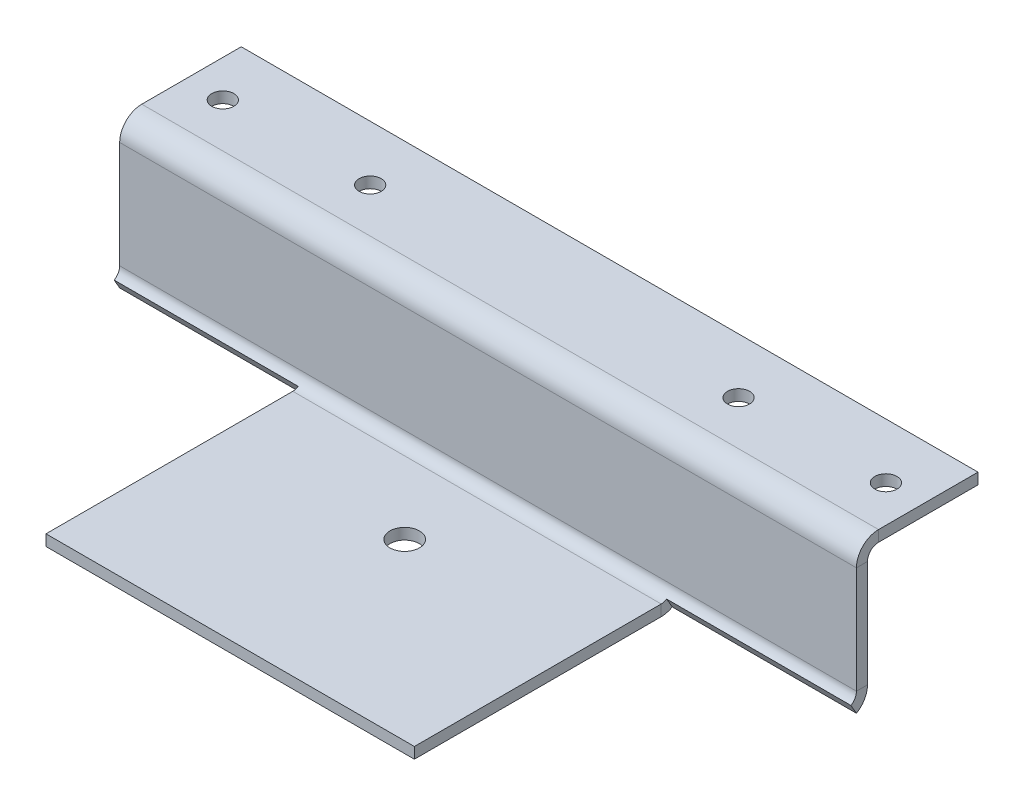
ISO-10303-21;
HEADER;
FILE_DESCRIPTION(('STEP AP214'),'2;1');
FILE_NAME('part.step','',(''),(''),'','','');
FILE_SCHEMA(('AUTOMOTIVE_DESIGN { 1 0 10303 214 1 1 1 1 }'));
ENDSEC;
DATA;
#1=APPLICATION_CONTEXT('core data for automotive mechanical design processes');
#2=APPLICATION_PROTOCOL_DEFINITION('international standard','automotive_design',2000,#1);
#3=PRODUCT_CONTEXT('',#1,'mechanical');
#4=PRODUCT('Part','Part','',(#3));
#5=PRODUCT_RELATED_PRODUCT_CATEGORY('part','',(#4));
#6=PRODUCT_DEFINITION_FORMATION('','',#4);
#7=PRODUCT_DEFINITION_CONTEXT('part definition',#1,'design');
#8=PRODUCT_DEFINITION('design','',#6,#7);
#9=PRODUCT_DEFINITION_SHAPE('','',#8);
#10=(LENGTH_UNIT() NAMED_UNIT(*) SI_UNIT(.MILLI.,.METRE.));
#11=(NAMED_UNIT(*) PLANE_ANGLE_UNIT() SI_UNIT($,.RADIAN.));
#12=(NAMED_UNIT(*) SI_UNIT($,.STERADIAN.) SOLID_ANGLE_UNIT());
#13=UNCERTAINTY_MEASURE_WITH_UNIT(LENGTH_MEASURE(1.E-05),#10,'distance_accuracy_value','');
#14=(GEOMETRIC_REPRESENTATION_CONTEXT(3) GLOBAL_UNCERTAINTY_ASSIGNED_CONTEXT((#13)) GLOBAL_UNIT_ASSIGNED_CONTEXT((#10,
#11,#12)) REPRESENTATION_CONTEXT('',''));
#15=CARTESIAN_POINT('',(0.,0.,0.));
#16=DIRECTION('',(0.,0.,1.));
#17=DIRECTION('',(1.,0.,0.));
#18=AXIS2_PLACEMENT_3D('',#15,#16,#17);
#19=CARTESIAN_POINT('',(0.,-41.,0.));
#20=DIRECTION('',(0.,1.,0.));
#21=DIRECTION('',(0.,0.,1.));
#22=AXIS2_PLACEMENT_3D('',#19,#20,#21);
#23=PLANE('',#22);
#24=CARTESIAN_POINT('',(0.,-41.,25.63));
#25=DIRECTION('',(0.,1.,0.));
#26=DIRECTION('',(0.,0.,1.));
#27=AXIS2_PLACEMENT_3D('',#24,#25,#26);
#28=CIRCLE('',#27,4.);
#29=CARTESIAN_POINT('',(0.,-41.,29.63));
#30=VERTEX_POINT('',#29);
#31=EDGE_CURVE('E653',#30,#30,#28,.T.);
#32=ORIENTED_EDGE('',*,*,#31,.T.);
#33=EDGE_LOOP('',(#32));
#34=FACE_BOUND('',#33,.T.);
#35=DIRECTION('',(0.,0.,1.));
#36=VECTOR('',#35,1.);
#37=CARTESIAN_POINT('',(50.,-41.,73.0000000000003));
#38=LINE('',#37,#36);
#39=CARTESIAN_POINT('',(50.,-41.,6.00000000000013));
#40=VERTEX_POINT('',#39);
#41=CARTESIAN_POINT('',(50.,-41.,73.0000000000001));
#42=VERTEX_POINT('',#41);
#43=EDGE_CURVE('E617',#40,#42,#38,.T.);
#44=ORIENTED_EDGE('',*,*,#43,.T.);
#45=DIRECTION('',(-1.,0.,0.));
#46=VECTOR('',#45,1.);
#47=CARTESIAN_POINT('',(-100.,-41.,73.0000000000002));
#48=LINE('',#47,#46);
#49=CARTESIAN_POINT('',(-50.,-41.,73.0000000000001));
#50=VERTEX_POINT('',#49);
#51=EDGE_CURVE('E58',#42,#50,#48,.T.);
#52=ORIENTED_EDGE('',*,*,#51,.T.);
#53=DIRECTION('',(0.,0.,1.));
#54=VECTOR('',#53,1.);
#55=CARTESIAN_POINT('',(-50.,-41.,0.));
#56=LINE('',#55,#54);
#57=CARTESIAN_POINT('',(-50.,-41.,6.00000000000013));
#58=VERTEX_POINT('',#57);
#59=EDGE_CURVE('E645',#50,#58,#56,.F.);
#60=ORIENTED_EDGE('',*,*,#59,.T.);
#61=DIRECTION('',(-1.,0.,0.));
#62=VECTOR('',#61,1.);
#63=CARTESIAN_POINT('',(0.,-41.,6.00000000000013));
#64=LINE('',#63,#62);
#65=EDGE_CURVE('E662',#40,#58,#64,.T.);
#66=ORIENTED_EDGE('',*,*,#65,.F.);
#67=EDGE_LOOP('',(#44,#52,#60,#66));
#68=FACE_BOUND('',#67,.T.);
#69=ADVANCED_FACE('F35',(#34,#68),#23,.F.);
#70=CARTESIAN_POINT('',(0.,-38.,0.));
#71=DIRECTION('',(0.,1.,0.));
#72=DIRECTION('',(0.,0.,1.));
#73=AXIS2_PLACEMENT_3D('',#70,#71,#72);
#74=PLANE('',#73);
#75=CARTESIAN_POINT('',(0.,-38.,25.63));
#76=DIRECTION('',(0.,1.,0.));
#77=DIRECTION('',(0.,0.,1.));
#78=AXIS2_PLACEMENT_3D('',#75,#76,#77);
#79=CIRCLE('',#78,4.);
#80=CARTESIAN_POINT('',(0.,-38.,29.63));
#81=VERTEX_POINT('',#80);
#82=EDGE_CURVE('E656',#81,#81,#79,.T.);
#83=ORIENTED_EDGE('',*,*,#82,.F.);
#84=EDGE_LOOP('',(#83));
#85=FACE_BOUND('',#84,.T.);
#86=DIRECTION('',(-1.,0.,0.));
#87=VECTOR('',#86,1.);
#88=CARTESIAN_POINT('',(-100.,-38.,73.0000000000002));
#89=LINE('',#88,#87);
#90=CARTESIAN_POINT('',(50.,-38.,73.0000000000001));
#91=VERTEX_POINT('',#90);
#92=CARTESIAN_POINT('',(-50.,-38.,73.0000000000001));
#93=VERTEX_POINT('',#92);
#94=EDGE_CURVE('E174',#91,#93,#89,.T.);
#95=ORIENTED_EDGE('',*,*,#94,.F.);
#96=DIRECTION('',(0.,0.,1.));
#97=VECTOR('',#96,1.);
#98=CARTESIAN_POINT('',(50.,-38.,0.));
#99=LINE('',#98,#97);
#100=CARTESIAN_POINT('',(50.,-38.0000000000002,6.00000000000013));
#101=VERTEX_POINT('',#100);
#102=EDGE_CURVE('E618',#101,#91,#99,.T.);
#103=ORIENTED_EDGE('',*,*,#102,.F.);
#104=DIRECTION('',(1.,0.,0.));
#105=VECTOR('',#104,1.);
#106=CARTESIAN_POINT('',(-100.,-38.,6.00000000000014));
#107=LINE('',#106,#105);
#108=CARTESIAN_POINT('',(-50.,-38.,6.00000000000013));
#109=VERTEX_POINT('',#108);
#110=EDGE_CURVE('E659',#109,#101,#107,.T.);
#111=ORIENTED_EDGE('',*,*,#110,.F.);
#112=DIRECTION('',(0.,0.,-1.));
#113=VECTOR('',#112,1.);
#114=CARTESIAN_POINT('',(-50.,-38.,73.0000000000003));
#115=LINE('',#114,#113);
#116=EDGE_CURVE('E642',#93,#109,#115,.T.);
#117=ORIENTED_EDGE('',*,*,#116,.F.);
#118=EDGE_LOOP('',(#95,#103,#111,#117));
#119=FACE_BOUND('',#118,.T.);
#120=ADVANCED_FACE('F281',(#85,#119),#74,.T.);
#121=CARTESIAN_POINT('',(100.,-35.0000000000001,6.00000000000011));
#122=DIRECTION('',(1.,0.,0.));
#123=DIRECTION('',(0.,-1.,0.));
#124=AXIS2_PLACEMENT_3D('',#121,#122,#123);
#125=CYLINDRICAL_SURFACE('',#124,6.00000000000011);
#126=CARTESIAN_POINT('',(100.,-35.0000000000001,6.00000000000011));
#127=DIRECTION('',(1.,0.,0.));
#128=DIRECTION('',(0.,1.,0.));
#129=AXIS2_PLACEMENT_3D('',#126,#127,#128);
#130=CIRCLE('',#129,6.00000000000011);
#131=CARTESIAN_POINT('',(100.,-40.1961524227069,3.00000000000024));
#132=VERTEX_POINT('',#131);
#133=CARTESIAN_POINT('',(100.,-34.9999999999999,0.));
#134=VERTEX_POINT('',#133);
#135=EDGE_CURVE('E667',#132,#134,#130,.T.);
#136=ORIENTED_EDGE('',*,*,#135,.F.);
#137=DIRECTION('',(1.,0.,0.));
#138=VECTOR('',#137,1.);
#139=CARTESIAN_POINT('',(100.,-40.196152422707,3.00000000000025));
#140=LINE('',#139,#138);
#141=CARTESIAN_POINT('',(50.,-40.1961524227069,3.00000000000026));
#142=VERTEX_POINT('',#141);
#143=EDGE_CURVE('E50',#142,#132,#140,.T.);
#144=ORIENTED_EDGE('',*,*,#143,.F.);
#145=CARTESIAN_POINT('',(50.,-35.,6.00000000000012));
#146=DIRECTION('',(-1.,0.,0.));
#147=DIRECTION('',(0.,0.,1.));
#148=AXIS2_PLACEMENT_3D('',#145,#146,#147);
#149=CIRCLE('',#148,6.00000000000011);
#150=EDGE_CURVE('E610',#40,#142,#149,.F.);
#151=ORIENTED_EDGE('',*,*,#150,.F.);
#152=ORIENTED_EDGE('',*,*,#65,.T.);
#153=CARTESIAN_POINT('',(-50.,-34.9999999999999,6.00000000000013));
#154=DIRECTION('',(1.,0.,0.));
#155=DIRECTION('',(0.,0.,-1.));
#156=AXIS2_PLACEMENT_3D('',#153,#154,#155);
#157=CIRCLE('',#156,6.00000000000011);
#158=CARTESIAN_POINT('',(-50.,-40.1961524227068,3.00000000000028));
#159=VERTEX_POINT('',#158);
#160=EDGE_CURVE('E635',#159,#58,#157,.F.);
#161=ORIENTED_EDGE('',*,*,#160,.F.);
#162=DIRECTION('',(1.,0.,0.));
#163=VECTOR('',#162,1.);
#164=CARTESIAN_POINT('',(100.,-40.196152422707,3.00000000000028));
#165=LINE('',#164,#163);
#166=CARTESIAN_POINT('',(-100.,-40.1961524227068,3.00000000000028));
#167=VERTEX_POINT('',#166);
#168=EDGE_CURVE('E625',#167,#159,#165,.T.);
#169=ORIENTED_EDGE('',*,*,#168,.F.);
#170=CARTESIAN_POINT('',(-100.,-34.9999999999999,6.00000000000014));
#171=DIRECTION('',(1.,0.,0.));
#172=DIRECTION('',(0.,1.,0.));
#173=AXIS2_PLACEMENT_3D('',#170,#171,#172);
#174=CIRCLE('',#173,6.00000000000011);
#175=CARTESIAN_POINT('',(-100.,-34.9999999999998,1.41146760699974E-13));
#176=VERTEX_POINT('',#175);
#177=EDGE_CURVE('E183',#176,#167,#174,.F.);
#178=ORIENTED_EDGE('',*,*,#177,.F.);
#179=DIRECTION('',(1.,0.,0.));
#180=VECTOR('',#179,1.);
#181=CARTESIAN_POINT('',(100.,-34.9999999999999,0.));
#182=LINE('',#181,#180);
#183=EDGE_CURVE('E665',#134,#176,#182,.F.);
#184=ORIENTED_EDGE('',*,*,#183,.F.);
#185=EDGE_LOOP('',(#136,#144,#151,#152,#161,#169,#178,#184));
#186=FACE_BOUND('',#185,.T.);
#187=ADVANCED_FACE('F287',(#186),#125,.T.);
#188=CARTESIAN_POINT('',(100.,-35.0000000000001,6.00000000000011));
#189=DIRECTION('',(1.,0.,0.));
#190=DIRECTION('',(0.,-1.,0.));
#191=AXIS2_PLACEMENT_3D('',#188,#189,#190);
#192=CYLINDRICAL_SURFACE('',#191,3.00000000000011);
#193=DIRECTION('',(1.,0.,0.));
#194=VECTOR('',#193,1.);
#195=CARTESIAN_POINT('',(100.,-37.5980762113536,4.50000000000015));
#196=LINE('',#195,#194);
#197=CARTESIAN_POINT('',(50.,-37.5980762113535,4.50000000000017));
#198=VERTEX_POINT('',#197);
#199=CARTESIAN_POINT('',(100.,-37.5980762113536,4.50000000000015));
#200=VERTEX_POINT('',#199);
#201=EDGE_CURVE('E150',#198,#200,#196,.T.);
#202=ORIENTED_EDGE('',*,*,#201,.T.);
#203=CARTESIAN_POINT('',(100.,-35.0000000000001,6.00000000000011));
#204=DIRECTION('',(1.,0.,0.));
#205=DIRECTION('',(0.,1.,0.));
#206=AXIS2_PLACEMENT_3D('',#203,#204,#205);
#207=CIRCLE('',#206,3.00000000000011);
#208=CARTESIAN_POINT('',(100.,-34.9999999999999,3.00000000000012));
#209=VERTEX_POINT('',#208);
#210=EDGE_CURVE('E161',#200,#209,#207,.T.);
#211=ORIENTED_EDGE('',*,*,#210,.T.);
#212=DIRECTION('',(1.,0.,0.));
#213=VECTOR('',#212,1.);
#214=CARTESIAN_POINT('',(100.,-35.,3.));
#215=LINE('',#214,#213);
#216=CARTESIAN_POINT('',(-100.,-34.9999999999998,3.00000000000014));
#217=VERTEX_POINT('',#216);
#218=EDGE_CURVE('E170',#209,#217,#215,.F.);
#219=ORIENTED_EDGE('',*,*,#218,.T.);
#220=CARTESIAN_POINT('',(-100.,-34.9999999999999,6.00000000000014));
#221=DIRECTION('',(1.,0.,0.));
#222=DIRECTION('',(0.,1.,0.));
#223=AXIS2_PLACEMENT_3D('',#220,#221,#222);
#224=CIRCLE('',#223,3.00000000000011);
#225=CARTESIAN_POINT('',(-100.,-37.5980762113534,4.50000000000019));
#226=VERTEX_POINT('',#225);
#227=EDGE_CURVE('E172',#217,#226,#224,.F.);
#228=ORIENTED_EDGE('',*,*,#227,.T.);
#229=DIRECTION('',(1.,0.,0.));
#230=VECTOR('',#229,1.);
#231=CARTESIAN_POINT('',(100.,-37.5980762113536,4.50000000000017));
#232=LINE('',#231,#230);
#233=CARTESIAN_POINT('',(-50.,-37.5980762113534,4.50000000000018));
#234=VERTEX_POINT('',#233);
#235=EDGE_CURVE('E632',#226,#234,#232,.T.);
#236=ORIENTED_EDGE('',*,*,#235,.T.);
#237=CARTESIAN_POINT('',(-50.,-34.9999999999999,6.00000000000013));
#238=DIRECTION('',(1.,0.,0.));
#239=DIRECTION('',(0.,1.,0.));
#240=AXIS2_PLACEMENT_3D('',#237,#238,#239);
#241=CIRCLE('',#240,3.00000000000011);
#242=EDGE_CURVE('E628',#234,#109,#241,.F.);
#243=ORIENTED_EDGE('',*,*,#242,.T.);
#244=ORIENTED_EDGE('',*,*,#110,.T.);
#245=CARTESIAN_POINT('',(50.,-35.,6.00000000000012));
#246=DIRECTION('',(1.,0.,0.));
#247=DIRECTION('',(0.,1.,0.));
#248=AXIS2_PLACEMENT_3D('',#245,#246,#247);
#249=CIRCLE('',#248,3.00000000000011);
#250=EDGE_CURVE('E164',#101,#198,#249,.T.);
#251=ORIENTED_EDGE('',*,*,#250,.T.);
#252=EDGE_LOOP('',(#202,#211,#219,#228,#236,#243,#244,#251));
#253=FACE_BOUND('',#252,.T.);
#254=ADVANCED_FACE('F159',(#253),#192,.F.);
#255=CARTESIAN_POINT('',(-100.,-41.,73.0000000000002));
#256=DIRECTION('',(0.,0.,-1.));
#257=DIRECTION('',(-1.,0.,0.));
#258=AXIS2_PLACEMENT_3D('',#255,#256,#257);
#259=PLANE('',#258);
#260=DIRECTION('',(0.,-1.,0.));
#261=VECTOR('',#260,1.);
#262=CARTESIAN_POINT('',(50.,-41.,73.0000000000001));
#263=LINE('',#262,#261);
#264=EDGE_CURVE('E622',#42,#91,#263,.F.);
#265=ORIENTED_EDGE('',*,*,#264,.T.);
#266=ORIENTED_EDGE('',*,*,#94,.T.);
#267=DIRECTION('',(0.,1.,0.));
#268=VECTOR('',#267,1.);
#269=CARTESIAN_POINT('',(-50.,-38.,73.0000000000001));
#270=LINE('',#269,#268);
#271=EDGE_CURVE('E647',#93,#50,#270,.F.);
#272=ORIENTED_EDGE('',*,*,#271,.T.);
#273=ORIENTED_EDGE('',*,*,#51,.F.);
#274=EDGE_LOOP('',(#265,#266,#272,#273));
#275=FACE_BOUND('',#274,.T.);
#276=ADVANCED_FACE('F295',(#275),#259,.F.);
#277=CARTESIAN_POINT('',(100.,-35.0000000000001,6.00000000000011));
#278=DIRECTION('',(-1.,0.,0.));
#279=DIRECTION('',(0.,-1.,0.));
#280=AXIS2_PLACEMENT_3D('',#277,#278,#279);
#281=PLANE('',#280);
#282=ORIENTED_EDGE('',*,*,#210,.F.);
#283=DIRECTION('',(0.,-0.866025403784456,-0.499999999999969));
#284=VECTOR('',#283,1.);
#285=CARTESIAN_POINT('',(100.,-40.1961524227069,3.00000000000025));
#286=LINE('',#285,#284);
#287=EDGE_CURVE('E147',#132,#200,#286,.F.);
#288=ORIENTED_EDGE('',*,*,#287,.F.);
#289=ORIENTED_EDGE('',*,*,#135,.T.);
#290=DIRECTION('',(0.,0.,-1.));
#291=VECTOR('',#290,1.);
#292=CARTESIAN_POINT('',(100.,-35.,3.));
#293=LINE('',#292,#291);
#294=EDGE_CURVE('E169',#209,#134,#293,.T.);
#295=ORIENTED_EDGE('',*,*,#294,.F.);
#296=EDGE_LOOP('',(#282,#288,#289,#295));
#297=FACE_BOUND('',#296,.T.);
#298=ADVANCED_FACE('F167',(#297),#281,.F.);
#299=CARTESIAN_POINT('',(-100.,-34.9999999999999,6.00000000000014));
#300=DIRECTION('',(-1.,0.,0.));
#301=DIRECTION('',(0.,-1.,0.));
#302=AXIS2_PLACEMENT_3D('',#299,#300,#301);
#303=PLANE('',#302);
#304=ORIENTED_EDGE('',*,*,#177,.T.);
#305=DIRECTION('',(0.,-0.866025403784459,-0.499999999999964));
#306=VECTOR('',#305,1.);
#307=CARTESIAN_POINT('',(-100.,-40.1961524227068,3.00000000000028));
#308=LINE('',#307,#306);
#309=EDGE_CURVE('E631',#167,#226,#308,.F.);
#310=ORIENTED_EDGE('',*,*,#309,.T.);
#311=ORIENTED_EDGE('',*,*,#227,.F.);
#312=DIRECTION('',(0.,0.,-1.));
#313=VECTOR('',#312,1.);
#314=CARTESIAN_POINT('',(-100.,-34.9999999999998,3.00000000000003));
#315=LINE('',#314,#313);
#316=EDGE_CURVE('E178',#217,#176,#315,.T.);
#317=ORIENTED_EDGE('',*,*,#316,.T.);
#318=EDGE_LOOP('',(#304,#310,#311,#317));
#319=FACE_BOUND('',#318,.T.);
#320=ADVANCED_FACE('F304',(#319),#303,.T.);
#321=CARTESIAN_POINT('',(100.,-38.,3.00000000000013));
#322=DIRECTION('',(1.,0.,0.));
#323=DIRECTION('',(0.,0.,-1.));
#324=AXIS2_PLACEMENT_3D('',#321,#322,#323);
#325=PLANE('',#324);
#326=DIRECTION('',(0.,-1.,0.));
#327=VECTOR('',#326,1.);
#328=CARTESIAN_POINT('',(100.,-38.,3.00000000000013));
#329=LINE('',#328,#327);
#330=CARTESIAN_POINT('',(100.,-5.99999999999997,3.00000000000002));
#331=VERTEX_POINT('',#330);
#332=EDGE_CURVE('E196',#331,#209,#329,.T.);
#333=ORIENTED_EDGE('',*,*,#332,.T.);
#334=ORIENTED_EDGE('',*,*,#294,.T.);
#335=DIRECTION('',(0.,-1.,0.));
#336=VECTOR('',#335,1.);
#337=CARTESIAN_POINT('',(100.,-38.,1.27128268733558E-13));
#338=LINE('',#337,#336);
#339=CARTESIAN_POINT('',(100.,-5.99999999999998,0.));
#340=VERTEX_POINT('',#339);
#341=EDGE_CURVE('E195',#340,#134,#338,.T.);
#342=ORIENTED_EDGE('',*,*,#341,.F.);
#343=DIRECTION('',(0.,0.,1.));
#344=VECTOR('',#343,1.);
#345=CARTESIAN_POINT('',(100.,-5.99999999999999,0.));
#346=LINE('',#345,#344);
#347=EDGE_CURVE('E181',#340,#331,#346,.T.);
#348=ORIENTED_EDGE('',*,*,#347,.T.);
#349=EDGE_LOOP('',(#333,#334,#342,#348));
#350=FACE_BOUND('',#349,.T.);
#351=ADVANCED_FACE('F307',(#350),#325,.T.);
#352=CARTESIAN_POINT('',(0.,0.,3.00000000000001));
#353=DIRECTION('',(0.,0.,1.));
#354=DIRECTION('',(0.,-1.,0.));
#355=AXIS2_PLACEMENT_3D('',#352,#353,#354);
#356=PLANE('',#355);
#357=DIRECTION('',(0.,1.,0.));
#358=VECTOR('',#357,1.);
#359=CARTESIAN_POINT('',(-100.,-2.99999999999999,3.00000000000003));
#360=LINE('',#359,#358);
#361=CARTESIAN_POINT('',(-100.,-5.99999999999999,3.00000000000004));
#362=VERTEX_POINT('',#361);
#363=EDGE_CURVE('E199',#217,#362,#360,.T.);
#364=ORIENTED_EDGE('',*,*,#363,.F.);
#365=ORIENTED_EDGE('',*,*,#218,.F.);
#366=ORIENTED_EDGE('',*,*,#332,.F.);
#367=DIRECTION('',(-1.,0.,0.));
#368=VECTOR('',#367,1.);
#369=CARTESIAN_POINT('',(0.,-5.99999999999999,3.00000000000003));
#370=LINE('',#369,#368);
#371=EDGE_CURVE('E190',#331,#362,#370,.T.);
#372=ORIENTED_EDGE('',*,*,#371,.T.);
#373=EDGE_LOOP('',(#364,#365,#366,#372));
#374=FACE_BOUND('',#373,.T.);
#375=ADVANCED_FACE('F311',(#374),#356,.T.);
#376=CARTESIAN_POINT('',(0.,0.,0.));
#377=DIRECTION('',(0.,0.,1.));
#378=DIRECTION('',(0.,-1.,0.));
#379=AXIS2_PLACEMENT_3D('',#376,#377,#378);
#380=PLANE('',#379);
#381=ORIENTED_EDGE('',*,*,#183,.T.);
#382=DIRECTION('',(0.,1.,0.));
#383=VECTOR('',#382,1.);
#384=CARTESIAN_POINT('',(-100.,-3.,0.));
#385=LINE('',#384,#383);
#386=CARTESIAN_POINT('',(-100.,-5.99999999999998,0.));
#387=VERTEX_POINT('',#386);
#388=EDGE_CURVE('E200',#176,#387,#385,.T.);
#389=ORIENTED_EDGE('',*,*,#388,.T.);
#390=DIRECTION('',(-1.,0.,0.));
#391=VECTOR('',#390,1.);
#392=CARTESIAN_POINT('',(100.,-5.99999999999999,0.));
#393=LINE('',#392,#391);
#394=EDGE_CURVE('E184',#340,#387,#393,.T.);
#395=ORIENTED_EDGE('',*,*,#394,.F.);
#396=ORIENTED_EDGE('',*,*,#341,.T.);
#397=EDGE_LOOP('',(#381,#389,#395,#396));
#398=FACE_BOUND('',#397,.T.);
#399=ADVANCED_FACE('F314',(#398),#380,.F.);
#400=CARTESIAN_POINT('',(-100.,-3.,0.));
#401=DIRECTION('',(-1.,0.,0.));
#402=DIRECTION('',(0.,0.,1.));
#403=AXIS2_PLACEMENT_3D('',#400,#401,#402);
#404=PLANE('',#403);
#405=DIRECTION('',(0.,0.,1.));
#406=VECTOR('',#405,1.);
#407=CARTESIAN_POINT('',(-100.,-3.,0.));
#408=LINE('',#407,#406);
#409=CARTESIAN_POINT('',(-100.,-3.,-30.));
#410=VERTEX_POINT('',#409);
#411=CARTESIAN_POINT('',(-100.,-2.99999999999998,-2.99999999999996));
#412=VERTEX_POINT('',#411);
#413=EDGE_CURVE('E235',#410,#412,#408,.T.);
#414=ORIENTED_EDGE('',*,*,#413,.T.);
#415=DIRECTION('',(0.,1.,0.));
#416=VECTOR('',#415,1.);
#417=CARTESIAN_POINT('',(-100.,-2.99999999999998,-2.99999999999996));
#418=LINE('',#417,#416);
#419=CARTESIAN_POINT('',(-100.,0.,-2.99999999999996));
#420=VERTEX_POINT('',#419);
#421=EDGE_CURVE('E213',#412,#420,#418,.T.);
#422=ORIENTED_EDGE('',*,*,#421,.T.);
#423=DIRECTION('',(0.,0.,1.));
#424=VECTOR('',#423,1.);
#425=CARTESIAN_POINT('',(-100.,0.,0.));
#426=LINE('',#425,#424);
#427=CARTESIAN_POINT('',(-100.,0.,-30.));
#428=VERTEX_POINT('',#427);
#429=EDGE_CURVE('E232',#428,#420,#426,.T.);
#430=ORIENTED_EDGE('',*,*,#429,.F.);
#431=DIRECTION('',(0.,1.,0.));
#432=VECTOR('',#431,1.);
#433=CARTESIAN_POINT('',(-100.,-3.,-30.));
#434=LINE('',#433,#432);
#435=EDGE_CURVE('E11',#410,#428,#434,.T.);
#436=ORIENTED_EDGE('',*,*,#435,.F.);
#437=EDGE_LOOP('',(#414,#422,#430,#436));
#438=FACE_BOUND('',#437,.T.);
#439=ADVANCED_FACE('F249',(#438),#404,.T.);
#440=CARTESIAN_POINT('',(0.,-3.,0.));
#441=DIRECTION('',(0.,1.,0.));
#442=DIRECTION('',(0.,0.,1.));
#443=AXIS2_PLACEMENT_3D('',#440,#441,#442);
#444=PLANE('',#443);
#445=CARTESIAN_POINT('',(90.,-3.,-15.));
#446=DIRECTION('',(0.,1.,0.));
#447=DIRECTION('',(0.,0.,1.));
#448=AXIS2_PLACEMENT_3D('',#445,#446,#447);
#449=CIRCLE('',#448,3.00000000000001);
#450=CARTESIAN_POINT('',(90.,-3.,-12.));
#451=VERTEX_POINT('',#450);
#452=EDGE_CURVE('E587',#451,#451,#449,.T.);
#453=ORIENTED_EDGE('',*,*,#452,.T.);
#454=EDGE_LOOP('',(#453));
#455=FACE_BOUND('',#454,.T.);
#456=CARTESIAN_POINT('',(50.,-3.,-15.));
#457=DIRECTION('',(0.,1.,0.));
#458=DIRECTION('',(0.,0.,1.));
#459=AXIS2_PLACEMENT_3D('',#456,#457,#458);
#460=CIRCLE('',#459,3.);
#461=CARTESIAN_POINT('',(50.,-3.,-12.));
#462=VERTEX_POINT('',#461);
#463=EDGE_CURVE('E595',#462,#462,#460,.T.);
#464=ORIENTED_EDGE('',*,*,#463,.T.);
#465=EDGE_LOOP('',(#464));
#466=FACE_BOUND('',#465,.T.);
#467=CARTESIAN_POINT('',(-50.,-3.,-15.));
#468=DIRECTION('',(0.,1.,0.));
#469=DIRECTION('',(0.,0.,1.));
#470=AXIS2_PLACEMENT_3D('',#467,#468,#469);
#471=CIRCLE('',#470,3.);
#472=CARTESIAN_POINT('',(-50.,-3.,-12.));
#473=VERTEX_POINT('',#472);
#474=EDGE_CURVE('E601',#473,#473,#471,.T.);
#475=ORIENTED_EDGE('',*,*,#474,.T.);
#476=EDGE_LOOP('',(#475));
#477=FACE_BOUND('',#476,.T.);
#478=CARTESIAN_POINT('',(-90.,-3.,-15.));
#479=DIRECTION('',(0.,1.,0.));
#480=DIRECTION('',(0.,0.,1.));
#481=AXIS2_PLACEMENT_3D('',#478,#479,#480);
#482=CIRCLE('',#481,3.00000000000001);
#483=CARTESIAN_POINT('',(-90.,-3.,-12.));
#484=VERTEX_POINT('',#483);
#485=EDGE_CURVE('E607',#484,#484,#482,.T.);
#486=ORIENTED_EDGE('',*,*,#485,.T.);
#487=EDGE_LOOP('',(#486));
#488=FACE_BOUND('',#487,.T.);
#489=DIRECTION('',(-1.,0.,0.));
#490=VECTOR('',#489,1.);
#491=CARTESIAN_POINT('',(-100.,-2.99999999999998,-2.99999999999996));
#492=LINE('',#491,#490);
#493=CARTESIAN_POINT('',(100.,-2.99999999999998,-2.99999999999999));
#494=VERTEX_POINT('',#493);
#495=EDGE_CURVE('E219',#412,#494,#492,.F.);
#496=ORIENTED_EDGE('',*,*,#495,.F.);
#497=ORIENTED_EDGE('',*,*,#413,.F.);
#498=DIRECTION('',(-1.,0.,0.));
#499=VECTOR('',#498,1.);
#500=CARTESIAN_POINT('',(100.,-3.,-30.));
#501=LINE('',#500,#499);
#502=CARTESIAN_POINT('',(100.,-3.,-30.));
#503=VERTEX_POINT('',#502);
#504=EDGE_CURVE('E231',#503,#410,#501,.T.);
#505=ORIENTED_EDGE('',*,*,#504,.F.);
#506=DIRECTION('',(0.,0.,-1.));
#507=VECTOR('',#506,1.);
#508=CARTESIAN_POINT('',(100.,-3.,0.));
#509=LINE('',#508,#507);
#510=EDGE_CURVE('E229',#494,#503,#509,.T.);
#511=ORIENTED_EDGE('',*,*,#510,.F.);
#512=EDGE_LOOP('',(#496,#497,#505,#511));
#513=FACE_BOUND('',#512,.T.);
#514=ADVANCED_FACE('F263',(#455,#466,#477,#488,#513),#444,.F.);
#515=CARTESIAN_POINT('',(0.,0.,0.));
#516=DIRECTION('',(0.,1.,0.));
#517=DIRECTION('',(0.,0.,1.));
#518=AXIS2_PLACEMENT_3D('',#515,#516,#517);
#519=PLANE('',#518);
#520=CARTESIAN_POINT('',(90.,0.,-15.));
#521=DIRECTION('',(0.,1.,0.));
#522=DIRECTION('',(0.,0.,1.));
#523=AXIS2_PLACEMENT_3D('',#520,#521,#522);
#524=CIRCLE('',#523,3.00000000000001);
#525=CARTESIAN_POINT('',(90.,0.,-12.));
#526=VERTEX_POINT('',#525);
#527=EDGE_CURVE('E590',#526,#526,#524,.T.);
#528=ORIENTED_EDGE('',*,*,#527,.F.);
#529=EDGE_LOOP('',(#528));
#530=FACE_BOUND('',#529,.T.);
#531=CARTESIAN_POINT('',(50.,0.,-15.));
#532=DIRECTION('',(0.,1.,0.));
#533=DIRECTION('',(0.,0.,1.));
#534=AXIS2_PLACEMENT_3D('',#531,#532,#533);
#535=CIRCLE('',#534,3.);
#536=CARTESIAN_POINT('',(50.,0.,-12.));
#537=VERTEX_POINT('',#536);
#538=EDGE_CURVE('E592',#537,#537,#535,.T.);
#539=ORIENTED_EDGE('',*,*,#538,.F.);
#540=EDGE_LOOP('',(#539));
#541=FACE_BOUND('',#540,.T.);
#542=CARTESIAN_POINT('',(-50.,0.,-15.));
#543=DIRECTION('',(0.,1.,0.));
#544=DIRECTION('',(0.,0.,1.));
#545=AXIS2_PLACEMENT_3D('',#542,#543,#544);
#546=CIRCLE('',#545,3.);
#547=CARTESIAN_POINT('',(-50.,0.,-12.));
#548=VERTEX_POINT('',#547);
#549=EDGE_CURVE('E598',#548,#548,#546,.T.);
#550=ORIENTED_EDGE('',*,*,#549,.F.);
#551=EDGE_LOOP('',(#550));
#552=FACE_BOUND('',#551,.T.);
#553=CARTESIAN_POINT('',(-90.,0.,-15.));
#554=DIRECTION('',(0.,1.,0.));
#555=DIRECTION('',(0.,0.,1.));
#556=AXIS2_PLACEMENT_3D('',#553,#554,#555);
#557=CIRCLE('',#556,3.00000000000001);
#558=CARTESIAN_POINT('',(-90.,0.,-12.));
#559=VERTEX_POINT('',#558);
#560=EDGE_CURVE('E604',#559,#559,#557,.T.);
#561=ORIENTED_EDGE('',*,*,#560,.F.);
#562=EDGE_LOOP('',(#561));
#563=FACE_BOUND('',#562,.T.);
#564=ORIENTED_EDGE('',*,*,#429,.T.);
#565=DIRECTION('',(-1.,0.,0.));
#566=VECTOR('',#565,1.);
#567=CARTESIAN_POINT('',(-100.,0.,-2.99999999999996));
#568=LINE('',#567,#566);
#569=CARTESIAN_POINT('',(100.,0.,-2.99999999999999));
#570=VERTEX_POINT('',#569);
#571=EDGE_CURVE('E206',#420,#570,#568,.F.);
#572=ORIENTED_EDGE('',*,*,#571,.T.);
#573=DIRECTION('',(0.,0.,-1.));
#574=VECTOR('',#573,1.);
#575=CARTESIAN_POINT('',(100.,0.,0.));
#576=LINE('',#575,#574);
#577=CARTESIAN_POINT('',(100.,0.,-30.));
#578=VERTEX_POINT('',#577);
#579=EDGE_CURVE('E226',#570,#578,#576,.T.);
#580=ORIENTED_EDGE('',*,*,#579,.T.);
#581=DIRECTION('',(-1.,0.,0.));
#582=VECTOR('',#581,1.);
#583=CARTESIAN_POINT('',(100.,0.,-30.));
#584=LINE('',#583,#582);
#585=EDGE_CURVE('E239',#578,#428,#584,.T.);
#586=ORIENTED_EDGE('',*,*,#585,.T.);
#587=EDGE_LOOP('',(#564,#572,#580,#586));
#588=FACE_BOUND('',#587,.T.);
#589=ADVANCED_FACE('F245',(#530,#541,#552,#563,#588),#519,.T.);
#590=CARTESIAN_POINT('',(100.,-3.,0.));
#591=DIRECTION('',(1.,0.,0.));
#592=DIRECTION('',(0.,0.,-1.));
#593=AXIS2_PLACEMENT_3D('',#590,#591,#592);
#594=PLANE('',#593);
#595=DIRECTION('',(0.,1.,0.));
#596=VECTOR('',#595,1.);
#597=CARTESIAN_POINT('',(100.,-2.99999999999998,-2.99999999999999));
#598=LINE('',#597,#596);
#599=EDGE_CURVE('E223',#494,#570,#598,.T.);
#600=ORIENTED_EDGE('',*,*,#599,.F.);
#601=ORIENTED_EDGE('',*,*,#510,.T.);
#602=DIRECTION('',(0.,1.,0.));
#603=VECTOR('',#602,1.);
#604=CARTESIAN_POINT('',(100.,-3.,-30.));
#605=LINE('',#604,#603);
#606=EDGE_CURVE('E39',#503,#578,#605,.T.);
#607=ORIENTED_EDGE('',*,*,#606,.T.);
#608=ORIENTED_EDGE('',*,*,#579,.F.);
#609=EDGE_LOOP('',(#600,#601,#607,#608));
#610=FACE_BOUND('',#609,.T.);
#611=ADVANCED_FACE('F37',(#610),#594,.T.);
#612=CARTESIAN_POINT('',(100.,-3.,-30.));
#613=DIRECTION('',(0.,0.,-1.));
#614=DIRECTION('',(-1.,0.,0.));
#615=AXIS2_PLACEMENT_3D('',#612,#613,#614);
#616=PLANE('',#615);
#617=ORIENTED_EDGE('',*,*,#585,.F.);
#618=ORIENTED_EDGE('',*,*,#606,.F.);
#619=ORIENTED_EDGE('',*,*,#504,.T.);
#620=ORIENTED_EDGE('',*,*,#435,.T.);
#621=EDGE_LOOP('',(#617,#618,#619,#620));
#622=FACE_BOUND('',#621,.T.);
#623=ADVANCED_FACE('F270',(#622),#616,.T.);
#624=CARTESIAN_POINT('',(100.,-5.99999999999999,-2.99999999999999));
#625=DIRECTION('',(1.,0.,0.));
#626=DIRECTION('',(0.,0.,-1.));
#627=AXIS2_PLACEMENT_3D('',#624,#625,#626);
#628=PLANE('',#627);
#629=ORIENTED_EDGE('',*,*,#347,.F.);
#630=CARTESIAN_POINT('',(100.,-5.99999999999999,-2.99999999999999));
#631=DIRECTION('',(-1.,0.,0.));
#632=DIRECTION('',(0.,0.,1.));
#633=AXIS2_PLACEMENT_3D('',#630,#631,#632);
#634=CIRCLE('',#633,3.);
#635=EDGE_CURVE('E216',#494,#340,#634,.F.);
#636=ORIENTED_EDGE('',*,*,#635,.F.);
#637=ORIENTED_EDGE('',*,*,#599,.T.);
#638=CARTESIAN_POINT('',(100.,-5.99999999999999,-2.99999999999999));
#639=DIRECTION('',(-1.,0.,0.));
#640=DIRECTION('',(0.,0.,1.));
#641=AXIS2_PLACEMENT_3D('',#638,#639,#640);
#642=CIRCLE('',#641,6.);
#643=EDGE_CURVE('E209',#570,#331,#642,.F.);
#644=ORIENTED_EDGE('',*,*,#643,.T.);
#645=EDGE_LOOP('',(#629,#636,#637,#644));
#646=FACE_BOUND('',#645,.T.);
#647=ADVANCED_FACE('F272',(#646),#628,.T.);
#648=CARTESIAN_POINT('',(-100.,-5.99999999999999,-2.99999999999996));
#649=DIRECTION('',(1.,0.,0.));
#650=DIRECTION('',(0.,0.,-1.));
#651=AXIS2_PLACEMENT_3D('',#648,#649,#650);
#652=PLANE('',#651);
#653=CARTESIAN_POINT('',(-100.,-5.99999999999999,-2.99999999999996));
#654=DIRECTION('',(-1.,0.,0.));
#655=DIRECTION('',(0.,0.,1.));
#656=AXIS2_PLACEMENT_3D('',#653,#654,#655);
#657=CIRCLE('',#656,3.);
#658=EDGE_CURVE('E202',#387,#412,#657,.T.);
#659=ORIENTED_EDGE('',*,*,#658,.F.);
#660=DIRECTION('',(0.,0.,1.));
#661=VECTOR('',#660,1.);
#662=CARTESIAN_POINT('',(-100.,-5.99999999999998,0.));
#663=LINE('',#662,#661);
#664=EDGE_CURVE('E187',#387,#362,#663,.T.);
#665=ORIENTED_EDGE('',*,*,#664,.T.);
#666=CARTESIAN_POINT('',(-100.,-5.99999999999999,-2.99999999999996));
#667=DIRECTION('',(-1.,0.,0.));
#668=DIRECTION('',(0.,0.,1.));
#669=AXIS2_PLACEMENT_3D('',#666,#667,#668);
#670=CIRCLE('',#669,6.);
#671=EDGE_CURVE('E210',#362,#420,#670,.T.);
#672=ORIENTED_EDGE('',*,*,#671,.T.);
#673=ORIENTED_EDGE('',*,*,#421,.F.);
#674=EDGE_LOOP('',(#659,#665,#672,#673));
#675=FACE_BOUND('',#674,.T.);
#676=ADVANCED_FACE('F253',(#675),#652,.F.);
#677=CARTESIAN_POINT('',(-100.,-5.99999999999999,-2.99999999999996));
#678=DIRECTION('',(-1.,0.,0.));
#679=DIRECTION('',(0.,0.,1.));
#680=AXIS2_PLACEMENT_3D('',#677,#678,#679);
#681=CYLINDRICAL_SURFACE('',#680,6.);
#682=ORIENTED_EDGE('',*,*,#571,.F.);
#683=ORIENTED_EDGE('',*,*,#671,.F.);
#684=ORIENTED_EDGE('',*,*,#371,.F.);
#685=ORIENTED_EDGE('',*,*,#643,.F.);
#686=EDGE_LOOP('',(#682,#683,#684,#685));
#687=FACE_BOUND('',#686,.T.);
#688=ADVANCED_FACE('F326',(#687),#681,.T.);
#689=CARTESIAN_POINT('',(-100.,-5.99999999999999,-2.99999999999996));
#690=DIRECTION('',(-1.,0.,0.));
#691=DIRECTION('',(0.,0.,1.));
#692=AXIS2_PLACEMENT_3D('',#689,#690,#691);
#693=CYLINDRICAL_SURFACE('',#692,3.);
#694=ORIENTED_EDGE('',*,*,#495,.T.);
#695=ORIENTED_EDGE('',*,*,#635,.T.);
#696=ORIENTED_EDGE('',*,*,#394,.T.);
#697=ORIENTED_EDGE('',*,*,#658,.T.);
#698=EDGE_LOOP('',(#694,#695,#696,#697));
#699=FACE_BOUND('',#698,.T.);
#700=ADVANCED_FACE('F258',(#699),#693,.F.);
#701=CARTESIAN_POINT('',(-100.,-2.99999999999999,3.00000000000003));
#702=DIRECTION('',(-1.,0.,0.));
#703=DIRECTION('',(0.,0.,1.));
#704=AXIS2_PLACEMENT_3D('',#701,#702,#703);
#705=PLANE('',#704);
#706=ORIENTED_EDGE('',*,*,#316,.F.);
#707=ORIENTED_EDGE('',*,*,#363,.T.);
#708=ORIENTED_EDGE('',*,*,#664,.F.);
#709=ORIENTED_EDGE('',*,*,#388,.F.);
#710=EDGE_LOOP('',(#706,#707,#708,#709));
#711=FACE_BOUND('',#710,.T.);
#712=ADVANCED_FACE('F319',(#711),#705,.T.);
#713=CARTESIAN_POINT('',(0.,-41.,25.63));
#714=DIRECTION('',(0.,1.,0.));
#715=DIRECTION('',(0.,0.,1.));
#716=AXIS2_PLACEMENT_3D('',#713,#714,#715);
#717=CYLINDRICAL_SURFACE('',#716,4.);
#718=ORIENTED_EDGE('',*,*,#82,.T.);
#719=EDGE_LOOP('',(#718));
#720=FACE_BOUND('',#719,.T.);
#721=ORIENTED_EDGE('',*,*,#31,.F.);
#722=EDGE_LOOP('',(#721));
#723=FACE_BOUND('',#722,.T.);
#724=ADVANCED_FACE('F292',(#720,#723),#717,.F.);
#725=CARTESIAN_POINT('',(-50.,-38.,73.0000000000003));
#726=DIRECTION('',(1.,0.,0.));
#727=DIRECTION('',(0.,0.,-1.));
#728=AXIS2_PLACEMENT_3D('',#725,#726,#727);
#729=PLANE('',#728);
#730=ORIENTED_EDGE('',*,*,#116,.T.);
#731=DIRECTION('',(0.,1.,0.));
#732=VECTOR('',#731,1.);
#733=CARTESIAN_POINT('',(-50.,-38.,6.00000000000013));
#734=LINE('',#733,#732);
#735=EDGE_CURVE('E650',#109,#58,#734,.F.);
#736=ORIENTED_EDGE('',*,*,#735,.T.);
#737=ORIENTED_EDGE('',*,*,#59,.F.);
#738=ORIENTED_EDGE('',*,*,#271,.F.);
#739=EDGE_LOOP('',(#730,#736,#737,#738));
#740=FACE_BOUND('',#739,.T.);
#741=ADVANCED_FACE('F465',(#740),#729,.F.);
#742=CARTESIAN_POINT('',(-50.,-34.9999999999999,6.00000000000013));
#743=DIRECTION('',(-1.,0.,0.));
#744=DIRECTION('',(0.,0.,1.));
#745=AXIS2_PLACEMENT_3D('',#742,#743,#744);
#746=PLANE('',#745);
#747=DIRECTION('',(0.,-0.866025403784458,-0.499999999999966));
#748=VECTOR('',#747,1.);
#749=CARTESIAN_POINT('',(-50.,-40.1961524227068,3.00000000000028));
#750=LINE('',#749,#748);
#751=EDGE_CURVE('E639',#159,#234,#750,.F.);
#752=ORIENTED_EDGE('',*,*,#751,.F.);
#753=ORIENTED_EDGE('',*,*,#160,.T.);
#754=ORIENTED_EDGE('',*,*,#735,.F.);
#755=ORIENTED_EDGE('',*,*,#242,.F.);
#756=EDGE_LOOP('',(#752,#753,#754,#755));
#757=FACE_BOUND('',#756,.T.);
#758=ADVANCED_FACE('F474',(#757),#746,.T.);
#759=CARTESIAN_POINT('',(-75.,-40.1961524227068,3.00000000000031));
#760=DIRECTION('',(0.,0.499999999999963,-0.86602540378446));
#761=DIRECTION('',(1.,0.,0.));
#762=AXIS2_PLACEMENT_3D('',#759,#760,#761);
#763=PLANE('',#762);
#764=ORIENTED_EDGE('',*,*,#168,.T.);
#765=ORIENTED_EDGE('',*,*,#751,.T.);
#766=ORIENTED_EDGE('',*,*,#235,.F.);
#767=ORIENTED_EDGE('',*,*,#309,.F.);
#768=EDGE_LOOP('',(#764,#765,#766,#767));
#769=FACE_BOUND('',#768,.T.);
#770=ADVANCED_FACE('F484',(#769),#763,.F.);
#771=CARTESIAN_POINT('',(50.,-41.,73.0000000000003));
#772=DIRECTION('',(-1.,0.,0.));
#773=DIRECTION('',(0.,0.,1.));
#774=AXIS2_PLACEMENT_3D('',#771,#772,#773);
#775=PLANE('',#774);
#776=ORIENTED_EDGE('',*,*,#264,.F.);
#777=ORIENTED_EDGE('',*,*,#43,.F.);
#778=DIRECTION('',(0.,-1.,0.));
#779=VECTOR('',#778,1.);
#780=CARTESIAN_POINT('',(50.,-41.,6.00000000000013));
#781=LINE('',#780,#779);
#782=EDGE_CURVE('E620',#40,#101,#781,.F.);
#783=ORIENTED_EDGE('',*,*,#782,.T.);
#784=ORIENTED_EDGE('',*,*,#102,.T.);
#785=EDGE_LOOP('',(#776,#777,#783,#784));
#786=FACE_BOUND('',#785,.T.);
#787=ADVANCED_FACE('F495',(#786),#775,.F.);
#788=CARTESIAN_POINT('',(75.,-40.1961524227069,3.00000000000026));
#789=DIRECTION('',(0.,0.499999999999967,-0.866025403784458));
#790=DIRECTION('',(1.,0.,0.));
#791=AXIS2_PLACEMENT_3D('',#788,#789,#790);
#792=PLANE('',#791);
#793=DIRECTION('',(0.,-0.866025403784459,-0.499999999999965));
#794=VECTOR('',#793,1.);
#795=CARTESIAN_POINT('',(50.,-40.1961524227069,3.00000000000026));
#796=LINE('',#795,#794);
#797=EDGE_CURVE('E155',#142,#198,#796,.F.);
#798=ORIENTED_EDGE('',*,*,#797,.F.);
#799=ORIENTED_EDGE('',*,*,#143,.T.);
#800=ORIENTED_EDGE('',*,*,#287,.T.);
#801=ORIENTED_EDGE('',*,*,#201,.F.);
#802=EDGE_LOOP('',(#798,#799,#800,#801));
#803=FACE_BOUND('',#802,.T.);
#804=ADVANCED_FACE('F149',(#803),#792,.F.);
#805=CARTESIAN_POINT('',(50.,-35.,6.00000000000012));
#806=DIRECTION('',(1.,0.,0.));
#807=DIRECTION('',(0.,0.,-1.));
#808=AXIS2_PLACEMENT_3D('',#805,#806,#807);
#809=PLANE('',#808);
#810=ORIENTED_EDGE('',*,*,#150,.T.);
#811=ORIENTED_EDGE('',*,*,#797,.T.);
#812=ORIENTED_EDGE('',*,*,#250,.F.);
#813=ORIENTED_EDGE('',*,*,#782,.F.);
#814=EDGE_LOOP('',(#810,#811,#812,#813));
#815=FACE_BOUND('',#814,.T.);
#816=ADVANCED_FACE('F515',(#815),#809,.T.);
#817=CARTESIAN_POINT('',(-90.,-3.,-15.));
#818=DIRECTION('',(0.,1.,0.));
#819=DIRECTION('',(0.,0.,1.));
#820=AXIS2_PLACEMENT_3D('',#817,#818,#819);
#821=CYLINDRICAL_SURFACE('',#820,3.00000000000001);
#822=ORIENTED_EDGE('',*,*,#485,.F.);
#823=EDGE_LOOP('',(#822));
#824=FACE_BOUND('',#823,.T.);
#825=ORIENTED_EDGE('',*,*,#560,.T.);
#826=EDGE_LOOP('',(#825));
#827=FACE_BOUND('',#826,.T.);
#828=ADVANCED_FACE('F524',(#824,#827),#821,.F.);
#829=CARTESIAN_POINT('',(-50.,-3.,-15.));
#830=DIRECTION('',(0.,1.,0.));
#831=DIRECTION('',(0.,0.,1.));
#832=AXIS2_PLACEMENT_3D('',#829,#830,#831);
#833=CYLINDRICAL_SURFACE('',#832,3.);
#834=ORIENTED_EDGE('',*,*,#474,.F.);
#835=EDGE_LOOP('',(#834));
#836=FACE_BOUND('',#835,.T.);
#837=ORIENTED_EDGE('',*,*,#549,.T.);
#838=EDGE_LOOP('',(#837));
#839=FACE_BOUND('',#838,.T.);
#840=ADVANCED_FACE('F535',(#836,#839),#833,.F.);
#841=CARTESIAN_POINT('',(50.,-3.,-15.));
#842=DIRECTION('',(0.,1.,0.));
#843=DIRECTION('',(0.,0.,1.));
#844=AXIS2_PLACEMENT_3D('',#841,#842,#843);
#845=CYLINDRICAL_SURFACE('',#844,3.);
#846=ORIENTED_EDGE('',*,*,#463,.F.);
#847=EDGE_LOOP('',(#846));
#848=FACE_BOUND('',#847,.T.);
#849=ORIENTED_EDGE('',*,*,#538,.T.);
#850=EDGE_LOOP('',(#849));
#851=FACE_BOUND('',#850,.T.);
#852=ADVANCED_FACE('F542',(#848,#851),#845,.F.);
#853=CARTESIAN_POINT('',(90.,-3.,-15.));
#854=DIRECTION('',(0.,1.,0.));
#855=DIRECTION('',(0.,0.,1.));
#856=AXIS2_PLACEMENT_3D('',#853,#854,#855);
#857=CYLINDRICAL_SURFACE('',#856,3.00000000000001);
#858=ORIENTED_EDGE('',*,*,#452,.F.);
#859=EDGE_LOOP('',(#858));
#860=FACE_BOUND('',#859,.T.);
#861=ORIENTED_EDGE('',*,*,#527,.T.);
#862=EDGE_LOOP('',(#861));
#863=FACE_BOUND('',#862,.T.);
#864=ADVANCED_FACE('F550',(#860,#863),#857,.F.);
#865=CLOSED_SHELL('',(#69,#120,#187,#254,#276,#298,#320,#351,#375,#399,#439,#514,#589,#611,#623,
#647,#676,#688,#700,#712,#724,#741,#758,#770,#787,#804,#816,#828,#840,#852,#864));
#866=MANIFOLD_SOLID_BREP('B2',#865);
#867=ADVANCED_BREP_SHAPE_REPRESENTATION('',(#18,#866),#14);
#868=SHAPE_DEFINITION_REPRESENTATION(#9,#867);
ENDSEC;
END-ISO-10303-21;
